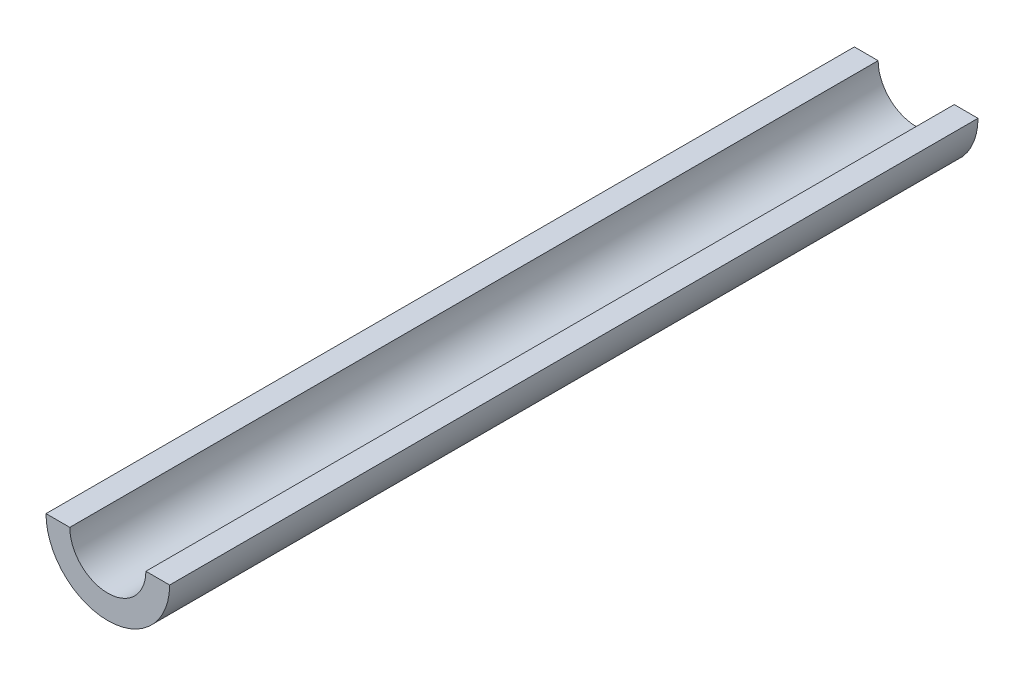
ISO-10303-21;
HEADER;
FILE_DESCRIPTION(('STEP AP214'),'2;1');
FILE_NAME('part.step','',(''),(''),'','','');
FILE_SCHEMA(('AUTOMOTIVE_DESIGN { 1 0 10303 214 1 1 1 1 }'));
ENDSEC;
DATA;
#1=APPLICATION_CONTEXT('core data for automotive mechanical design processes');
#2=APPLICATION_PROTOCOL_DEFINITION('international standard','automotive_design',2000,#1);
#3=PRODUCT_CONTEXT('',#1,'mechanical');
#4=PRODUCT('Part','Part','',(#3));
#5=PRODUCT_RELATED_PRODUCT_CATEGORY('part','',(#4));
#6=PRODUCT_DEFINITION_FORMATION('','',#4);
#7=PRODUCT_DEFINITION_CONTEXT('part definition',#1,'design');
#8=PRODUCT_DEFINITION('design','',#6,#7);
#9=PRODUCT_DEFINITION_SHAPE('','',#8);
#10=(LENGTH_UNIT() NAMED_UNIT(*) SI_UNIT(.MILLI.,.METRE.));
#11=(NAMED_UNIT(*) PLANE_ANGLE_UNIT() SI_UNIT($,.RADIAN.));
#12=(NAMED_UNIT(*) SI_UNIT($,.STERADIAN.) SOLID_ANGLE_UNIT());
#13=UNCERTAINTY_MEASURE_WITH_UNIT(LENGTH_MEASURE(1.E-05),#10,'distance_accuracy_value','');
#14=(GEOMETRIC_REPRESENTATION_CONTEXT(3) GLOBAL_UNCERTAINTY_ASSIGNED_CONTEXT((#13)) GLOBAL_UNIT_ASSIGNED_CONTEXT((#10,
#11,#12)) REPRESENTATION_CONTEXT('',''));
#15=CARTESIAN_POINT('',(0.,0.,0.));
#16=DIRECTION('',(0.,0.,1.));
#17=DIRECTION('',(1.,0.,0.));
#18=AXIS2_PLACEMENT_3D('',#15,#16,#17);
#19=CARTESIAN_POINT('',(0.,0.,170.));
#20=DIRECTION('',(0.,0.,-1.));
#21=DIRECTION('',(-1.,0.,0.));
#22=AXIS2_PLACEMENT_3D('',#19,#20,#21);
#23=CYLINDRICAL_SURFACE('',#22,13.);
#24=CARTESIAN_POINT('',(0.,0.,0.));
#25=DIRECTION('',(0.,0.,1.));
#26=DIRECTION('',(1.,0.,0.));
#27=AXIS2_PLACEMENT_3D('',#24,#25,#26);
#28=CIRCLE('',#27,13.);
#29=CARTESIAN_POINT('',(-13.,0.,0.));
#30=VERTEX_POINT('',#29);
#31=CARTESIAN_POINT('',(13.,0.,0.));
#32=VERTEX_POINT('',#31);
#33=EDGE_CURVE('E107',#30,#32,#28,.T.);
#34=ORIENTED_EDGE('',*,*,#33,.T.);
#35=DIRECTION('',(0.,0.,-1.));
#36=VECTOR('',#35,1.);
#37=CARTESIAN_POINT('',(13.,0.,170.));
#38=LINE('',#37,#36);
#39=CARTESIAN_POINT('',(13.,0.,170.));
#40=VERTEX_POINT('',#39);
#41=EDGE_CURVE('E11',#40,#32,#38,.T.);
#42=ORIENTED_EDGE('',*,*,#41,.F.);
#43=CARTESIAN_POINT('',(0.,0.,170.));
#44=DIRECTION('',(0.,0.,1.));
#45=DIRECTION('',(1.,0.,0.));
#46=AXIS2_PLACEMENT_3D('',#43,#44,#45);
#47=CIRCLE('',#46,13.);
#48=CARTESIAN_POINT('',(-13.,0.,170.));
#49=VERTEX_POINT('',#48);
#50=EDGE_CURVE('E91',#49,#40,#47,.T.);
#51=ORIENTED_EDGE('',*,*,#50,.F.);
#52=DIRECTION('',(0.,0.,-1.));
#53=VECTOR('',#52,1.);
#54=CARTESIAN_POINT('',(-13.,0.,170.));
#55=LINE('',#54,#53);
#56=EDGE_CURVE('E103',#49,#30,#55,.T.);
#57=ORIENTED_EDGE('',*,*,#56,.T.);
#58=EDGE_LOOP('',(#34,#42,#51,#57));
#59=FACE_BOUND('',#58,.T.);
#60=ADVANCED_FACE('F39',(#59),#23,.T.);
#61=CARTESIAN_POINT('',(8.,0.,170.));
#62=DIRECTION('',(0.,-1.,0.));
#63=DIRECTION('',(0.,0.,-1.));
#64=AXIS2_PLACEMENT_3D('',#61,#62,#63);
#65=PLANE('',#64);
#66=DIRECTION('',(-1.,0.,0.));
#67=VECTOR('',#66,1.);
#68=CARTESIAN_POINT('',(8.,0.,0.));
#69=LINE('',#68,#67);
#70=CARTESIAN_POINT('',(8.,0.,0.));
#71=VERTEX_POINT('',#70);
#72=EDGE_CURVE('E96',#32,#71,#69,.T.);
#73=ORIENTED_EDGE('',*,*,#72,.T.);
#74=DIRECTION('',(0.,0.,-1.));
#75=VECTOR('',#74,1.);
#76=CARTESIAN_POINT('',(8.,0.,170.));
#77=LINE('',#76,#75);
#78=CARTESIAN_POINT('',(8.,0.,170.));
#79=VERTEX_POINT('',#78);
#80=EDGE_CURVE('E48',#79,#71,#77,.T.);
#81=ORIENTED_EDGE('',*,*,#80,.F.);
#82=DIRECTION('',(-1.,0.,0.));
#83=VECTOR('',#82,1.);
#84=CARTESIAN_POINT('',(8.,0.,170.));
#85=LINE('',#84,#83);
#86=EDGE_CURVE('E86',#40,#79,#85,.T.);
#87=ORIENTED_EDGE('',*,*,#86,.F.);
#88=ORIENTED_EDGE('',*,*,#41,.T.);
#89=EDGE_LOOP('',(#73,#81,#87,#88));
#90=FACE_BOUND('',#89,.T.);
#91=ADVANCED_FACE('F95',(#90),#65,.F.);
#92=CARTESIAN_POINT('',(0.,0.,170.));
#93=DIRECTION('',(0.,0.,-1.));
#94=DIRECTION('',(-1.,0.,0.));
#95=AXIS2_PLACEMENT_3D('',#92,#93,#94);
#96=CYLINDRICAL_SURFACE('',#95,8.);
#97=CARTESIAN_POINT('',(0.,0.,0.));
#98=DIRECTION('',(0.,0.,-1.));
#99=DIRECTION('',(1.,0.,0.));
#100=AXIS2_PLACEMENT_3D('',#97,#98,#99);
#101=CIRCLE('',#100,8.);
#102=CARTESIAN_POINT('',(-8.,0.,0.));
#103=VERTEX_POINT('',#102);
#104=EDGE_CURVE('E73',#71,#103,#101,.T.);
#105=ORIENTED_EDGE('',*,*,#104,.T.);
#106=DIRECTION('',(0.,0.,-1.));
#107=VECTOR('',#106,1.);
#108=CARTESIAN_POINT('',(-8.,0.,170.));
#109=LINE('',#108,#107);
#110=CARTESIAN_POINT('',(-8.,0.,170.));
#111=VERTEX_POINT('',#110);
#112=EDGE_CURVE('E98',#111,#103,#109,.T.);
#113=ORIENTED_EDGE('',*,*,#112,.F.);
#114=CARTESIAN_POINT('',(0.,0.,170.));
#115=DIRECTION('',(0.,0.,-1.));
#116=DIRECTION('',(1.,0.,0.));
#117=AXIS2_PLACEMENT_3D('',#114,#115,#116);
#118=CIRCLE('',#117,8.);
#119=EDGE_CURVE('E89',#79,#111,#118,.T.);
#120=ORIENTED_EDGE('',*,*,#119,.F.);
#121=ORIENTED_EDGE('',*,*,#80,.T.);
#122=EDGE_LOOP('',(#105,#113,#120,#121));
#123=FACE_BOUND('',#122,.T.);
#124=ADVANCED_FACE('F99',(#123),#96,.F.);
#125=CARTESIAN_POINT('',(-13.,0.,170.));
#126=DIRECTION('',(0.,-1.,0.));
#127=DIRECTION('',(0.,0.,-1.));
#128=AXIS2_PLACEMENT_3D('',#125,#126,#127);
#129=PLANE('',#128);
#130=DIRECTION('',(-1.,0.,0.));
#131=VECTOR('',#130,1.);
#132=CARTESIAN_POINT('',(-13.,0.,0.));
#133=LINE('',#132,#131);
#134=EDGE_CURVE('E79',#103,#30,#133,.T.);
#135=ORIENTED_EDGE('',*,*,#134,.T.);
#136=ORIENTED_EDGE('',*,*,#56,.F.);
#137=DIRECTION('',(-1.,0.,0.));
#138=VECTOR('',#137,1.);
#139=CARTESIAN_POINT('',(-13.,0.,170.));
#140=LINE('',#139,#138);
#141=EDGE_CURVE('E56',#111,#49,#140,.T.);
#142=ORIENTED_EDGE('',*,*,#141,.F.);
#143=ORIENTED_EDGE('',*,*,#112,.T.);
#144=EDGE_LOOP('',(#135,#136,#142,#143));
#145=FACE_BOUND('',#144,.T.);
#146=ADVANCED_FACE('F120',(#145),#129,.F.);
#147=CARTESIAN_POINT('',(0.,0.,170.));
#148=DIRECTION('',(0.,0.,1.));
#149=DIRECTION('',(1.,0.,0.));
#150=AXIS2_PLACEMENT_3D('',#147,#148,#149);
#151=PLANE('',#150);
#152=ORIENTED_EDGE('',*,*,#50,.T.);
#153=ORIENTED_EDGE('',*,*,#86,.T.);
#154=ORIENTED_EDGE('',*,*,#119,.T.);
#155=ORIENTED_EDGE('',*,*,#141,.T.);
#156=EDGE_LOOP('',(#152,#153,#154,#155));
#157=FACE_BOUND('',#156,.T.);
#158=ADVANCED_FACE('F87',(#157),#151,.T.);
#159=CARTESIAN_POINT('',(0.,0.,0.));
#160=DIRECTION('',(0.,0.,1.));
#161=DIRECTION('',(1.,0.,0.));
#162=AXIS2_PLACEMENT_3D('',#159,#160,#161);
#163=PLANE('',#162);
#164=ORIENTED_EDGE('',*,*,#33,.F.);
#165=ORIENTED_EDGE('',*,*,#134,.F.);
#166=ORIENTED_EDGE('',*,*,#104,.F.);
#167=ORIENTED_EDGE('',*,*,#72,.F.);
#168=EDGE_LOOP('',(#164,#165,#166,#167));
#169=FACE_BOUND('',#168,.T.);
#170=ADVANCED_FACE('F123',(#169),#163,.F.);
#171=CLOSED_SHELL('',(#60,#91,#124,#146,#158,#170));
#172=MANIFOLD_SOLID_BREP('B2',#171);
#173=ADVANCED_BREP_SHAPE_REPRESENTATION('',(#18,#172),#14);
#174=SHAPE_DEFINITION_REPRESENTATION(#9,#173);
ENDSEC;
END-ISO-10303-21;
